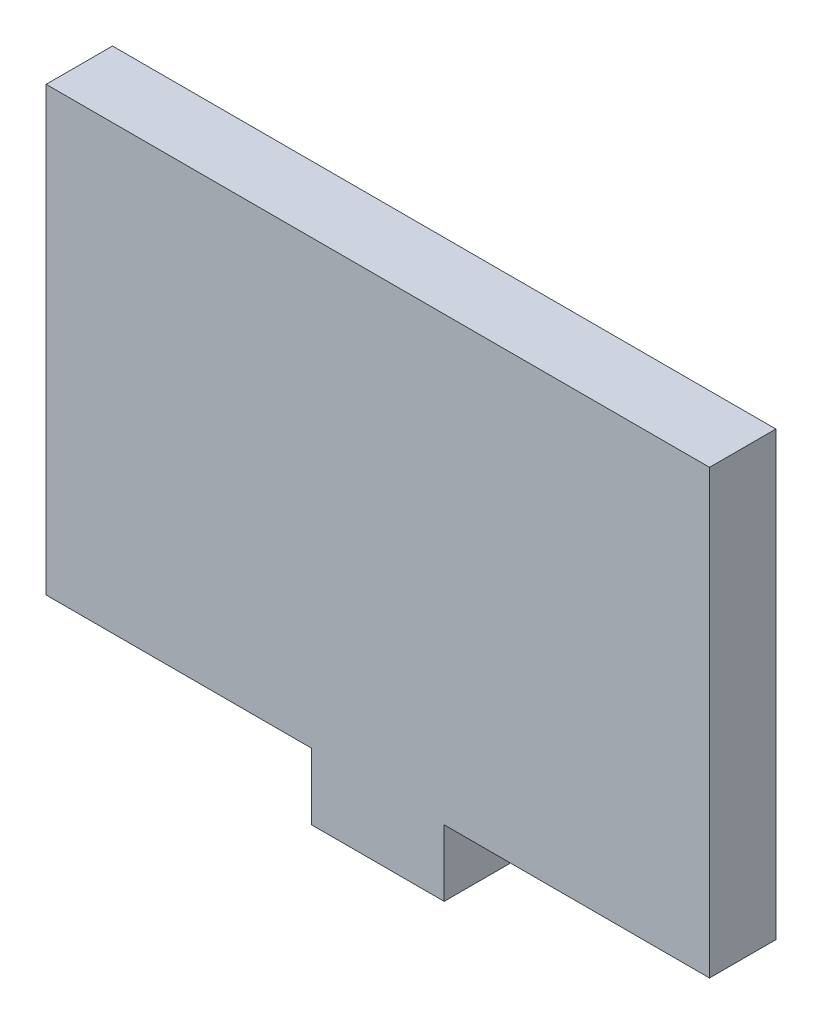
ISO-10303-21;
HEADER;
FILE_DESCRIPTION(('STEP AP214'),'2;1');
FILE_NAME('part.step','',(''),(''),'','','');
FILE_SCHEMA(('AUTOMOTIVE_DESIGN { 1 0 10303 214 1 1 1 1 }'));
ENDSEC;
DATA;
#1=APPLICATION_CONTEXT('core data for automotive mechanical design processes');
#2=APPLICATION_PROTOCOL_DEFINITION('international standard','automotive_design',2000,#1);
#3=PRODUCT_CONTEXT('',#1,'mechanical');
#4=PRODUCT('Part','Part','',(#3));
#5=PRODUCT_RELATED_PRODUCT_CATEGORY('part','',(#4));
#6=PRODUCT_DEFINITION_FORMATION('','',#4);
#7=PRODUCT_DEFINITION_CONTEXT('part definition',#1,'design');
#8=PRODUCT_DEFINITION('design','',#6,#7);
#9=PRODUCT_DEFINITION_SHAPE('','',#8);
#10=(LENGTH_UNIT() NAMED_UNIT(*) SI_UNIT(.MILLI.,.METRE.));
#11=(NAMED_UNIT(*) PLANE_ANGLE_UNIT() SI_UNIT($,.RADIAN.));
#12=(NAMED_UNIT(*) SI_UNIT($,.STERADIAN.) SOLID_ANGLE_UNIT());
#13=UNCERTAINTY_MEASURE_WITH_UNIT(LENGTH_MEASURE(1.E-05),#10,'distance_accuracy_value','');
#14=(GEOMETRIC_REPRESENTATION_CONTEXT(3) GLOBAL_UNCERTAINTY_ASSIGNED_CONTEXT((#13)) GLOBAL_UNIT_ASSIGNED_CONTEXT((#10,
#11,#12)) REPRESENTATION_CONTEXT('',''));
#15=CARTESIAN_POINT('',(0.,0.,0.));
#16=DIRECTION('',(0.,0.,1.));
#17=DIRECTION('',(1.,0.,0.));
#18=AXIS2_PLACEMENT_3D('',#15,#16,#17);
#19=CARTESIAN_POINT('',(15.,10.,3.));
#20=DIRECTION('',(-1.,0.,0.));
#21=DIRECTION('',(0.,0.,1.));
#22=AXIS2_PLACEMENT_3D('',#19,#20,#21);
#23=PLANE('',#22);
#24=DIRECTION('',(0.,1.,0.));
#25=VECTOR('',#24,1.);
#26=CARTESIAN_POINT('',(15.,10.,0.));
#27=LINE('',#26,#25);
#28=CARTESIAN_POINT('',(15.,-10.,0.));
#29=VERTEX_POINT('',#28);
#30=CARTESIAN_POINT('',(15.,10.,0.));
#31=VERTEX_POINT('',#30);
#32=EDGE_CURVE('E129',#29,#31,#27,.T.);
#33=ORIENTED_EDGE('',*,*,#32,.T.);
#34=DIRECTION('',(0.,0.,-1.));
#35=VECTOR('',#34,1.);
#36=CARTESIAN_POINT('',(15.,10.,3.));
#37=LINE('',#36,#35);
#38=CARTESIAN_POINT('',(15.,10.,3.));
#39=VERTEX_POINT('',#38);
#40=EDGE_CURVE('E11',#39,#31,#37,.T.);
#41=ORIENTED_EDGE('',*,*,#40,.F.);
#42=DIRECTION('',(0.,1.,0.));
#43=VECTOR('',#42,1.);
#44=CARTESIAN_POINT('',(15.,10.,3.));
#45=LINE('',#44,#43);
#46=CARTESIAN_POINT('',(15.,-10.,3.));
#47=VERTEX_POINT('',#46);
#48=EDGE_CURVE('E143',#47,#39,#45,.T.);
#49=ORIENTED_EDGE('',*,*,#48,.F.);
#50=DIRECTION('',(0.,0.,-1.));
#51=VECTOR('',#50,1.);
#52=CARTESIAN_POINT('',(15.,-10.,3.));
#53=LINE('',#52,#51);
#54=EDGE_CURVE('E125',#47,#29,#53,.T.);
#55=ORIENTED_EDGE('',*,*,#54,.T.);
#56=EDGE_LOOP('',(#33,#41,#49,#55));
#57=FACE_BOUND('',#56,.T.);
#58=ADVANCED_FACE('F33',(#57),#23,.F.);
#59=CARTESIAN_POINT('',(-15.,10.,3.));
#60=DIRECTION('',(0.,-1.,0.));
#61=DIRECTION('',(0.,0.,-1.));
#62=AXIS2_PLACEMENT_3D('',#59,#60,#61);
#63=PLANE('',#62);
#64=DIRECTION('',(-1.,0.,0.));
#65=VECTOR('',#64,1.);
#66=CARTESIAN_POINT('',(-15.,10.,0.));
#67=LINE('',#66,#65);
#68=CARTESIAN_POINT('',(-15.,10.,0.));
#69=VERTEX_POINT('',#68);
#70=EDGE_CURVE('E132',#31,#69,#67,.T.);
#71=ORIENTED_EDGE('',*,*,#70,.T.);
#72=DIRECTION('',(0.,0.,-1.));
#73=VECTOR('',#72,1.);
#74=CARTESIAN_POINT('',(-15.,10.,3.));
#75=LINE('',#74,#73);
#76=CARTESIAN_POINT('',(-15.,10.,3.));
#77=VERTEX_POINT('',#76);
#78=EDGE_CURVE('E41',#77,#69,#75,.T.);
#79=ORIENTED_EDGE('',*,*,#78,.F.);
#80=DIRECTION('',(-1.,0.,0.));
#81=VECTOR('',#80,1.);
#82=CARTESIAN_POINT('',(-15.,10.,3.));
#83=LINE('',#82,#81);
#84=EDGE_CURVE('E92',#39,#77,#83,.T.);
#85=ORIENTED_EDGE('',*,*,#84,.F.);
#86=ORIENTED_EDGE('',*,*,#40,.T.);
#87=EDGE_LOOP('',(#71,#79,#85,#86));
#88=FACE_BOUND('',#87,.T.);
#89=ADVANCED_FACE('F178',(#88),#63,.F.);
#90=CARTESIAN_POINT('',(-15.,10.,3.));
#91=DIRECTION('',(1.,0.,0.));
#92=DIRECTION('',(0.,1.,0.));
#93=AXIS2_PLACEMENT_3D('',#90,#91,#92);
#94=PLANE('',#93);
#95=DIRECTION('',(0.,-1.,0.));
#96=VECTOR('',#95,1.);
#97=CARTESIAN_POINT('',(-15.,10.,0.));
#98=LINE('',#97,#96);
#99=CARTESIAN_POINT('',(-15.,-10.,0.));
#100=VERTEX_POINT('',#99);
#101=EDGE_CURVE('E134',#69,#100,#98,.T.);
#102=ORIENTED_EDGE('',*,*,#101,.T.);
#103=DIRECTION('',(0.,0.,-1.));
#104=VECTOR('',#103,1.);
#105=CARTESIAN_POINT('',(-15.,-10.,3.));
#106=LINE('',#105,#104);
#107=CARTESIAN_POINT('',(-15.,-10.,3.));
#108=VERTEX_POINT('',#107);
#109=EDGE_CURVE('E150',#108,#100,#106,.T.);
#110=ORIENTED_EDGE('',*,*,#109,.F.);
#111=DIRECTION('',(0.,-1.,0.));
#112=VECTOR('',#111,1.);
#113=CARTESIAN_POINT('',(-15.,10.,3.));
#114=LINE('',#113,#112);
#115=EDGE_CURVE('E158',#77,#108,#114,.T.);
#116=ORIENTED_EDGE('',*,*,#115,.F.);
#117=ORIENTED_EDGE('',*,*,#78,.T.);
#118=EDGE_LOOP('',(#102,#110,#116,#117));
#119=FACE_BOUND('',#118,.T.);
#120=ADVANCED_FACE('F156',(#119),#94,.F.);
#121=CARTESIAN_POINT('',(-15.,-10.,3.));
#122=DIRECTION('',(0.,1.,0.));
#123=DIRECTION('',(0.,0.,1.));
#124=AXIS2_PLACEMENT_3D('',#121,#122,#123);
#125=PLANE('',#124);
#126=DIRECTION('',(1.,0.,0.));
#127=VECTOR('',#126,1.);
#128=CARTESIAN_POINT('',(-15.,-10.,0.));
#129=LINE('',#128,#127);
#130=CARTESIAN_POINT('',(-3.,-10.,0.));
#131=VERTEX_POINT('',#130);
#132=EDGE_CURVE('E136',#100,#131,#129,.T.);
#133=ORIENTED_EDGE('',*,*,#132,.T.);
#134=DIRECTION('',(0.,0.,-1.));
#135=VECTOR('',#134,1.);
#136=CARTESIAN_POINT('',(-3.,-10.,3.));
#137=LINE('',#136,#135);
#138=CARTESIAN_POINT('',(-3.,-10.,3.));
#139=VERTEX_POINT('',#138);
#140=EDGE_CURVE('E147',#139,#131,#137,.T.);
#141=ORIENTED_EDGE('',*,*,#140,.F.);
#142=DIRECTION('',(1.,0.,0.));
#143=VECTOR('',#142,1.);
#144=CARTESIAN_POINT('',(-15.,-10.,3.));
#145=LINE('',#144,#143);
#146=EDGE_CURVE('E170',#108,#139,#145,.T.);
#147=ORIENTED_EDGE('',*,*,#146,.F.);
#148=ORIENTED_EDGE('',*,*,#109,.T.);
#149=EDGE_LOOP('',(#133,#141,#147,#148));
#150=FACE_BOUND('',#149,.T.);
#151=ADVANCED_FACE('F166',(#150),#125,.F.);
#152=CARTESIAN_POINT('',(-3.,-10.,3.));
#153=DIRECTION('',(1.,0.,0.));
#154=DIRECTION('',(0.,1.,0.));
#155=AXIS2_PLACEMENT_3D('',#152,#153,#154);
#156=PLANE('',#155);
#157=DIRECTION('',(0.,-1.,0.));
#158=VECTOR('',#157,1.);
#159=CARTESIAN_POINT('',(-3.,-10.,0.));
#160=LINE('',#159,#158);
#161=CARTESIAN_POINT('',(-3.,-13.,0.));
#162=VERTEX_POINT('',#161);
#163=EDGE_CURVE('E138',#131,#162,#160,.T.);
#164=ORIENTED_EDGE('',*,*,#163,.T.);
#165=DIRECTION('',(0.,0.,-1.));
#166=VECTOR('',#165,1.);
#167=CARTESIAN_POINT('',(-3.,-13.,3.));
#168=LINE('',#167,#166);
#169=CARTESIAN_POINT('',(-3.,-13.,3.));
#170=VERTEX_POINT('',#169);
#171=EDGE_CURVE('E120',#170,#162,#168,.T.);
#172=ORIENTED_EDGE('',*,*,#171,.F.);
#173=DIRECTION('',(0.,-1.,0.));
#174=VECTOR('',#173,1.);
#175=CARTESIAN_POINT('',(-3.,-10.,3.));
#176=LINE('',#175,#174);
#177=EDGE_CURVE('E111',#139,#170,#176,.T.);
#178=ORIENTED_EDGE('',*,*,#177,.F.);
#179=ORIENTED_EDGE('',*,*,#140,.T.);
#180=EDGE_LOOP('',(#164,#172,#178,#179));
#181=FACE_BOUND('',#180,.T.);
#182=ADVANCED_FACE('F169',(#181),#156,.F.);
#183=CARTESIAN_POINT('',(-3.,-13.,3.));
#184=DIRECTION('',(0.,1.,0.));
#185=DIRECTION('',(0.,0.,1.));
#186=AXIS2_PLACEMENT_3D('',#183,#184,#185);
#187=PLANE('',#186);
#188=DIRECTION('',(1.,0.,0.));
#189=VECTOR('',#188,1.);
#190=CARTESIAN_POINT('',(-3.,-13.,0.));
#191=LINE('',#190,#189);
#192=CARTESIAN_POINT('',(3.,-13.,0.));
#193=VERTEX_POINT('',#192);
#194=EDGE_CURVE('E119',#162,#193,#191,.T.);
#195=ORIENTED_EDGE('',*,*,#194,.T.);
#196=DIRECTION('',(0.,0.,-1.));
#197=VECTOR('',#196,1.);
#198=CARTESIAN_POINT('',(3.,-13.,3.));
#199=LINE('',#198,#197);
#200=CARTESIAN_POINT('',(3.,-13.,3.));
#201=VERTEX_POINT('',#200);
#202=EDGE_CURVE('E116',#201,#193,#199,.T.);
#203=ORIENTED_EDGE('',*,*,#202,.F.);
#204=DIRECTION('',(1.,0.,0.));
#205=VECTOR('',#204,1.);
#206=CARTESIAN_POINT('',(-3.,-13.,3.));
#207=LINE('',#206,#205);
#208=EDGE_CURVE('E105',#170,#201,#207,.T.);
#209=ORIENTED_EDGE('',*,*,#208,.F.);
#210=ORIENTED_EDGE('',*,*,#171,.T.);
#211=EDGE_LOOP('',(#195,#203,#209,#210));
#212=FACE_BOUND('',#211,.T.);
#213=ADVANCED_FACE('F117',(#212),#187,.F.);
#214=CARTESIAN_POINT('',(3.,-10.,3.));
#215=DIRECTION('',(-1.,0.,0.));
#216=DIRECTION('',(0.,-1.,0.));
#217=AXIS2_PLACEMENT_3D('',#214,#215,#216);
#218=PLANE('',#217);
#219=DIRECTION('',(0.,1.,0.));
#220=VECTOR('',#219,1.);
#221=CARTESIAN_POINT('',(3.,-10.,0.));
#222=LINE('',#221,#220);
#223=CARTESIAN_POINT('',(3.,-10.,0.));
#224=VERTEX_POINT('',#223);
#225=EDGE_CURVE('E78',#193,#224,#222,.T.);
#226=ORIENTED_EDGE('',*,*,#225,.T.);
#227=DIRECTION('',(0.,0.,-1.));
#228=VECTOR('',#227,1.);
#229=CARTESIAN_POINT('',(3.,-10.,3.));
#230=LINE('',#229,#228);
#231=CARTESIAN_POINT('',(3.,-10.,3.));
#232=VERTEX_POINT('',#231);
#233=EDGE_CURVE('E121',#232,#224,#230,.T.);
#234=ORIENTED_EDGE('',*,*,#233,.F.);
#235=DIRECTION('',(0.,1.,0.));
#236=VECTOR('',#235,1.);
#237=CARTESIAN_POINT('',(3.,-10.,3.));
#238=LINE('',#237,#236);
#239=EDGE_CURVE('E109',#201,#232,#238,.T.);
#240=ORIENTED_EDGE('',*,*,#239,.F.);
#241=ORIENTED_EDGE('',*,*,#202,.T.);
#242=EDGE_LOOP('',(#226,#234,#240,#241));
#243=FACE_BOUND('',#242,.T.);
#244=ADVANCED_FACE('F123',(#243),#218,.F.);
#245=CARTESIAN_POINT('',(3.,-10.,3.));
#246=DIRECTION('',(0.,1.,0.));
#247=DIRECTION('',(0.,0.,1.));
#248=AXIS2_PLACEMENT_3D('',#245,#246,#247);
#249=PLANE('',#248);
#250=DIRECTION('',(1.,0.,0.));
#251=VECTOR('',#250,1.);
#252=CARTESIAN_POINT('',(3.,-10.,0.));
#253=LINE('',#252,#251);
#254=EDGE_CURVE('E84',#224,#29,#253,.T.);
#255=ORIENTED_EDGE('',*,*,#254,.T.);
#256=ORIENTED_EDGE('',*,*,#54,.F.);
#257=DIRECTION('',(1.,0.,0.));
#258=VECTOR('',#257,1.);
#259=CARTESIAN_POINT('',(3.,-10.,3.));
#260=LINE('',#259,#258);
#261=EDGE_CURVE('E49',#232,#47,#260,.T.);
#262=ORIENTED_EDGE('',*,*,#261,.F.);
#263=ORIENTED_EDGE('',*,*,#233,.T.);
#264=EDGE_LOOP('',(#255,#256,#262,#263));
#265=FACE_BOUND('',#264,.T.);
#266=ADVANCED_FACE('F194',(#265),#249,.F.);
#267=CARTESIAN_POINT('',(0.,0.,3.));
#268=DIRECTION('',(0.,0.,1.));
#269=DIRECTION('',(1.,0.,0.));
#270=AXIS2_PLACEMENT_3D('',#267,#268,#269);
#271=PLANE('',#270);
#272=ORIENTED_EDGE('',*,*,#48,.T.);
#273=ORIENTED_EDGE('',*,*,#84,.T.);
#274=ORIENTED_EDGE('',*,*,#115,.T.);
#275=ORIENTED_EDGE('',*,*,#146,.T.);
#276=ORIENTED_EDGE('',*,*,#177,.T.);
#277=ORIENTED_EDGE('',*,*,#208,.T.);
#278=ORIENTED_EDGE('',*,*,#239,.T.);
#279=ORIENTED_EDGE('',*,*,#261,.T.);
#280=EDGE_LOOP('',(#272,#273,#274,#275,#276,#277,#278,#279));
#281=FACE_BOUND('',#280,.T.);
#282=ADVANCED_FACE('F107',(#281),#271,.T.);
#283=CARTESIAN_POINT('',(0.,0.,0.));
#284=DIRECTION('',(0.,0.,1.));
#285=DIRECTION('',(1.,0.,0.));
#286=AXIS2_PLACEMENT_3D('',#283,#284,#285);
#287=PLANE('',#286);
#288=ORIENTED_EDGE('',*,*,#32,.F.);
#289=ORIENTED_EDGE('',*,*,#254,.F.);
#290=ORIENTED_EDGE('',*,*,#225,.F.);
#291=ORIENTED_EDGE('',*,*,#194,.F.);
#292=ORIENTED_EDGE('',*,*,#163,.F.);
#293=ORIENTED_EDGE('',*,*,#132,.F.);
#294=ORIENTED_EDGE('',*,*,#101,.F.);
#295=ORIENTED_EDGE('',*,*,#70,.F.);
#296=EDGE_LOOP('',(#288,#289,#290,#291,#292,#293,#294,#295));
#297=FACE_BOUND('',#296,.T.);
#298=ADVANCED_FACE('F162',(#297),#287,.F.);
#299=CLOSED_SHELL('',(#58,#89,#120,#151,#182,#213,#244,#266,#282,#298));
#300=MANIFOLD_SOLID_BREP('B2',#299);
#301=ADVANCED_BREP_SHAPE_REPRESENTATION('',(#18,#300),#14);
#302=SHAPE_DEFINITION_REPRESENTATION(#9,#301);
ENDSEC;
END-ISO-10303-21;
